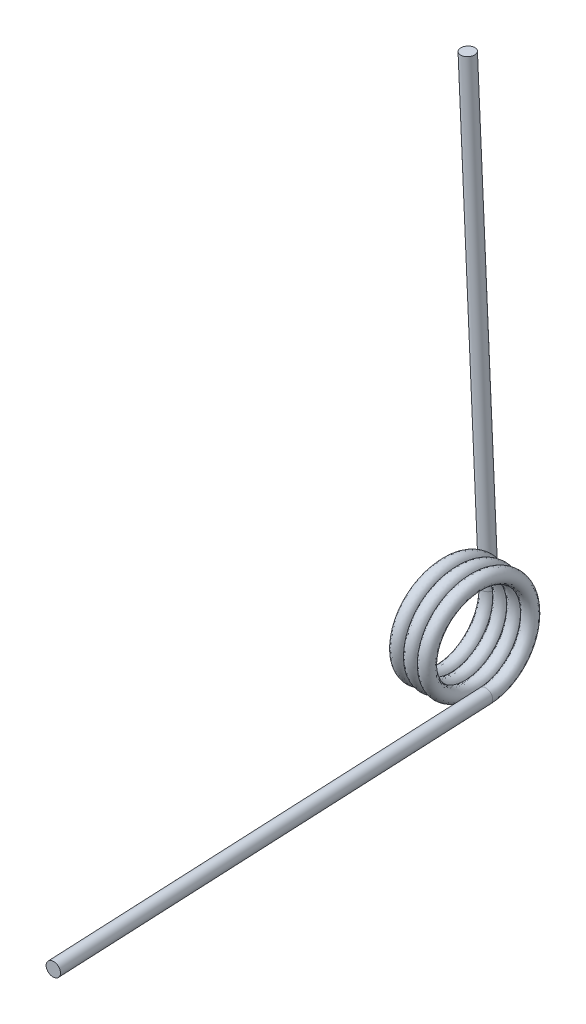
ISO-10303-21;
HEADER;
FILE_DESCRIPTION(('STEP AP214'),'2;1');
FILE_NAME('part.step','',(''),(''),'','','');
FILE_SCHEMA(('AUTOMOTIVE_DESIGN { 1 0 10303 214 1 1 1 1 }'));
ENDSEC;
DATA;
#1=APPLICATION_CONTEXT('core data for automotive mechanical design processes');
#2=APPLICATION_PROTOCOL_DEFINITION('international standard','automotive_design',2000,#1);
#3=PRODUCT_CONTEXT('',#1,'mechanical');
#4=PRODUCT('Part','Part','',(#3));
#5=PRODUCT_RELATED_PRODUCT_CATEGORY('part','',(#4));
#6=PRODUCT_DEFINITION_FORMATION('','',#4);
#7=PRODUCT_DEFINITION_CONTEXT('part definition',#1,'design');
#8=PRODUCT_DEFINITION('design','',#6,#7);
#9=PRODUCT_DEFINITION_SHAPE('','',#8);
#10=(LENGTH_UNIT() NAMED_UNIT(*) SI_UNIT(.MILLI.,.METRE.));
#11=(NAMED_UNIT(*) PLANE_ANGLE_UNIT() SI_UNIT($,.RADIAN.));
#12=(NAMED_UNIT(*) SI_UNIT($,.STERADIAN.) SOLID_ANGLE_UNIT());
#13=UNCERTAINTY_MEASURE_WITH_UNIT(LENGTH_MEASURE(1.E-05),#10,'distance_accuracy_value','');
#14=(GEOMETRIC_REPRESENTATION_CONTEXT(3) GLOBAL_UNCERTAINTY_ASSIGNED_CONTEXT((#13)) GLOBAL_UNIT_ASSIGNED_CONTEXT((#10,
#11,#12)) REPRESENTATION_CONTEXT('',''));
#15=CARTESIAN_POINT('',(0.,0.,0.));
#16=DIRECTION('',(0.,0.,1.));
#17=DIRECTION('',(1.,0.,0.));
#18=AXIS2_PLACEMENT_3D('',#15,#16,#17);
#19=CARTESIAN_POINT('',(-1.34478403028349,-9.4234,0.0617280478752123));
#20=CARTESIAN_POINT('',(-1.57126736361682,-9.4590387050573,-5.37887447880631));
#21=CARTESIAN_POINT('',(-1.79775069695015,-4.76515805758596,-8.13003976608467));
#22=CARTESIAN_POINT('',(-2.02423403028349,-0.0712774101146085,-10.881205053363));
#23=CARTESIAN_POINT('',(-2.25071736361682,4.65824194241404,-8.19176781395989));
#24=CARTESIAN_POINT('',(-2.47720069695015,9.3877612949427,-5.50233057455674));
#25=CARTESIAN_POINT('',(-2.70368403028349,9.4234,-0.0617280478752135));
#26=CARTESIAN_POINT('',(-2.93016736361682,9.45903870505731,5.37887447880631));
#27=CARTESIAN_POINT('',(-3.15665069695015,4.76515805758596,8.13003976608467));
#28=CARTESIAN_POINT('',(-3.38313403028348,0.0712774101146098,10.881205053363));
#29=CARTESIAN_POINT('',(-3.60961736361682,-4.65824194241404,8.19176781395989));
#30=CARTESIAN_POINT('',(-3.83610069695015,-9.38776129494269,5.50233057455674));
#31=CARTESIAN_POINT('',(-4.06258403028348,-9.4234,0.0617280478752123));
#32=CARTESIAN_POINT('',(-4.28906736361682,-9.4590387050573,-5.37887447880631));
#33=CARTESIAN_POINT('',(-4.51555069695015,-4.76515805758596,-8.13003976608467));
#34=CARTESIAN_POINT('',(-4.74203403028348,-0.0712774101146085,-10.881205053363));
#35=CARTESIAN_POINT('',(-4.96851736361681,4.65824194241404,-8.19176781395989));
#36=CARTESIAN_POINT('',(-5.19500069695015,9.3877612949427,-5.50233057455674));
#37=CARTESIAN_POINT('',(-5.42148403028348,9.4234,-0.0617280478752135));
#38=CARTESIAN_POINT('',(-5.64796736361681,9.45903870505731,5.37887447880631));
#39=CARTESIAN_POINT('',(-5.87445069695015,4.76515805758596,8.13003976608467));
#40=CARTESIAN_POINT('',(-6.10093403028348,0.0712774101146098,10.881205053363));
#41=CARTESIAN_POINT('',(-6.32741736361681,-4.65824194241404,8.19176781395989));
#42=CARTESIAN_POINT('',(-6.55390069695014,-9.38776129494269,5.50233057455674));
#43=CARTESIAN_POINT('',(-6.78038403028348,-9.4234,0.0617280478752123));
#44=CARTESIAN_POINT('',(-7.00686736361681,-9.4590387050573,-5.37887447880631));
#45=CARTESIAN_POINT('',(-7.23335069695014,-4.76515805758596,-8.13003976608467));
#46=CARTESIAN_POINT('',(-7.45983403028348,-0.0712774101146085,-10.881205053363));
#47=CARTESIAN_POINT('',(-7.68631736361681,4.65824194241404,-8.19176781395989));
#48=CARTESIAN_POINT('',(-7.91280069695014,9.3877612949427,-5.50233057455674));
#49=CARTESIAN_POINT('',(-8.13928403028347,9.4234,-0.0617280478752135));
#50=CARTESIAN_POINT('',(-8.36576736361681,9.45903870505731,5.37887447880631));
#51=CARTESIAN_POINT('',(-8.59225069695014,4.76515805758596,8.13003976608467));
#52=CARTESIAN_POINT('',(-8.81873403028347,0.0712774101146098,10.881205053363));
#53=CARTESIAN_POINT('',(-9.04521736361681,-4.65824194241404,8.19176781395989));
#54=CARTESIAN_POINT('',(-9.27170069695014,-9.38776129494269,5.50233057455674));
#55=CARTESIAN_POINT('',(-9.49818403028347,-9.4234,0.0617280478752123));
#56=CARTESIAN_POINT('',(-9.7246673636168,-9.4590387050573,-5.37887447880631));
#57=CARTESIAN_POINT('',(-9.95115069695014,-4.76515805758596,-8.13003976608467));
#58=CARTESIAN_POINT('',(-10.1776340302835,-0.0712774101146085,-10.881205053363));
#59=CARTESIAN_POINT('',(-10.4041173636168,4.65824194241404,-8.19176781395989));
#60=CARTESIAN_POINT('',(-10.6306006969501,9.3877612949427,-5.50233057455674));
#61=CARTESIAN_POINT('',(-10.8570840302835,9.4234,-0.0617280478752135));
#62=CARTESIAN_POINT('',(-11.0835673636168,9.45903870505731,5.37887447880631));
#63=CARTESIAN_POINT('',(-11.3100506969501,4.76515805758596,8.13003976608467));
#64=CARTESIAN_POINT('',(-11.5365340302835,0.0712774101146098,10.881205053363));
#65=CARTESIAN_POINT('',(-11.7630173636168,-4.65824194241404,8.19176781395989));
#66=CARTESIAN_POINT('',(-11.9895006969501,-9.38776129494269,5.50233057455674));
#67=CARTESIAN_POINT('',(-12.2159840302835,-9.4234,0.0617280478752123));
#68=CARTESIAN_POINT('',(-1.34478403028349,-6.731,0.0617280478752421));
#69=CARTESIAN_POINT('',(-1.57126736361682,-6.76663870505732,-3.82441661404013));
#70=CARTESIAN_POINT('',(-1.79775069695015,-3.41895805758598,-5.79835296893544));
#71=CARTESIAN_POINT('',(-2.02423403028349,-0.0712774101146428,-7.77228932383074));
#72=CARTESIAN_POINT('',(-2.25071736361682,3.31204194241402,-5.86008101681068));
#73=CARTESIAN_POINT('',(-2.47720069695015,6.69536129494268,-3.94787270979062));
#74=CARTESIAN_POINT('',(-2.70368403028348,6.731,-0.061728047875243));
#75=CARTESIAN_POINT('',(-2.93016736361682,6.76663870505732,3.82441661404013));
#76=CARTESIAN_POINT('',(-3.15665069695015,3.41895805758599,5.79835296893544));
#77=CARTESIAN_POINT('',(-3.38313403028348,0.0712774101146437,7.77228932383074));
#78=CARTESIAN_POINT('',(-3.60961736361682,-3.31204194241401,5.86008101681068));
#79=CARTESIAN_POINT('',(-3.83610069695015,-6.69536129494268,3.94787270979062));
#80=CARTESIAN_POINT('',(-4.06258403028348,-6.731,0.0617280478752421));
#81=CARTESIAN_POINT('',(-4.28906736361681,-6.76663870505732,-3.82441661404013));
#82=CARTESIAN_POINT('',(-4.51555069695015,-3.41895805758598,-5.79835296893544));
#83=CARTESIAN_POINT('',(-4.74203403028348,-0.0712774101146428,-7.77228932383074));
#84=CARTESIAN_POINT('',(-4.96851736361681,3.31204194241402,-5.86008101681068));
#85=CARTESIAN_POINT('',(-5.19500069695014,6.69536129494268,-3.94787270979062));
#86=CARTESIAN_POINT('',(-5.42148403028348,6.731,-0.061728047875243));
#87=CARTESIAN_POINT('',(-5.64796736361681,6.76663870505732,3.82441661404013));
#88=CARTESIAN_POINT('',(-5.87445069695014,3.41895805758599,5.79835296893544));
#89=CARTESIAN_POINT('',(-6.10093403028348,0.0712774101146437,7.77228932383074));
#90=CARTESIAN_POINT('',(-6.32741736361681,-3.31204194241401,5.86008101681068));
#91=CARTESIAN_POINT('',(-6.55390069695014,-6.69536129494268,3.94787270979062));
#92=CARTESIAN_POINT('',(-6.78038403028348,-6.731,0.0617280478752421));
#93=CARTESIAN_POINT('',(-7.00686736361681,-6.76663870505732,-3.82441661404013));
#94=CARTESIAN_POINT('',(-7.23335069695014,-3.41895805758598,-5.79835296893544));
#95=CARTESIAN_POINT('',(-7.45983403028347,-0.0712774101146428,-7.77228932383074));
#96=CARTESIAN_POINT('',(-7.68631736361681,3.31204194241402,-5.86008101681068));
#97=CARTESIAN_POINT('',(-7.91280069695014,6.69536129494268,-3.94787270979062));
#98=CARTESIAN_POINT('',(-8.13928403028347,6.731,-0.061728047875243));
#99=CARTESIAN_POINT('',(-8.3657673636168,6.76663870505732,3.82441661404013));
#100=CARTESIAN_POINT('',(-8.59225069695014,3.41895805758599,5.79835296893544));
#101=CARTESIAN_POINT('',(-8.81873403028347,0.0712774101146437,7.77228932383074));
#102=CARTESIAN_POINT('',(-9.0452173636168,-3.31204194241401,5.86008101681068));
#103=CARTESIAN_POINT('',(-9.27170069695014,-6.69536129494268,3.94787270979062));
#104=CARTESIAN_POINT('',(-9.49818403028347,-6.731,0.0617280478752421));
#105=CARTESIAN_POINT('',(-9.7246673636168,-6.76663870505732,-3.82441661404013));
#106=CARTESIAN_POINT('',(-9.95115069695013,-3.41895805758598,-5.79835296893544));
#107=CARTESIAN_POINT('',(-10.1776340302835,-0.0712774101146428,-7.77228932383074));
#108=CARTESIAN_POINT('',(-10.4041173636168,3.31204194241402,-5.86008101681068));
#109=CARTESIAN_POINT('',(-10.6306006969501,6.69536129494268,-3.94787270979062));
#110=CARTESIAN_POINT('',(-10.8570840302835,6.731,-0.061728047875243));
#111=CARTESIAN_POINT('',(-11.0835673636168,6.76663870505732,3.82441661404013));
#112=CARTESIAN_POINT('',(-11.3100506969501,3.41895805758599,5.79835296893544));
#113=CARTESIAN_POINT('',(-11.5365340302835,0.0712774101146437,7.77228932383074));
#114=CARTESIAN_POINT('',(-11.7630173636168,-3.31204194241401,5.86008101681068));
#115=CARTESIAN_POINT('',(-11.9895006969501,-6.69536129494268,3.94787270979062));
#116=CARTESIAN_POINT('',(-12.2159840302835,-6.731,0.0617280478752421));
#117=CARTESIAN_POINT('',(1.34478403028349,-6.731,-0.0617280478753799));
#118=CARTESIAN_POINT('',(1.11830069695016,-6.6953612949426,-3.94787270979075));
#119=CARTESIAN_POINT('',(0.891817363616824,-3.3120419424139,-5.86008101681075));
#120=CARTESIAN_POINT('',(0.665334030283492,0.0712774101148008,-7.77228932383074));
#121=CARTESIAN_POINT('',(0.438850696950159,3.4189580575861,-5.79835296893537));
#122=CARTESIAN_POINT('',(0.212367363616826,6.7666387050574,-3.82441661403999));
#123=CARTESIAN_POINT('',(-0.0141159697165068,6.731,0.061728047875379));
#124=CARTESIAN_POINT('',(-0.24059930304984,6.6953612949426,3.94787270979075));
#125=CARTESIAN_POINT('',(-0.467082636383172,3.3120419424139,5.86008101681075));
#126=CARTESIAN_POINT('',(-0.693565969716505,-0.0712774101147999,7.77228932383074));
#127=CARTESIAN_POINT('',(-0.920049303049838,-3.4189580575861,5.79835296893537));
#128=CARTESIAN_POINT('',(-1.14653263638317,-6.7666387050574,3.82441661404));
#129=CARTESIAN_POINT('',(-1.3730159697165,-6.731,-0.0617280478753799));
#130=CARTESIAN_POINT('',(-1.59949930304984,-6.6953612949426,-3.94787270979075));
#131=CARTESIAN_POINT('',(-1.82598263638317,-3.3120419424139,-5.86008101681075));
#132=CARTESIAN_POINT('',(-2.0524659697165,0.0712774101148008,-7.77228932383074));
#133=CARTESIAN_POINT('',(-2.27894930304983,3.4189580575861,-5.79835296893537));
#134=CARTESIAN_POINT('',(-2.50543263638317,6.7666387050574,-3.82441661403999));
#135=CARTESIAN_POINT('',(-2.7319159697165,6.731,0.061728047875379));
#136=CARTESIAN_POINT('',(-2.95839930304983,6.6953612949426,3.94787270979075));
#137=CARTESIAN_POINT('',(-3.18488263638317,3.3120419424139,5.86008101681075));
#138=CARTESIAN_POINT('',(-3.4113659697165,-0.0712774101147999,7.77228932383074));
#139=CARTESIAN_POINT('',(-3.63784930304983,-3.4189580575861,5.79835296893537));
#140=CARTESIAN_POINT('',(-3.86433263638317,-6.7666387050574,3.82441661404));
#141=CARTESIAN_POINT('',(-4.0908159697165,-6.731,-0.0617280478753799));
#142=CARTESIAN_POINT('',(-4.31729930304983,-6.6953612949426,-3.94787270979075));
#143=CARTESIAN_POINT('',(-4.54378263638316,-3.3120419424139,-5.86008101681075));
#144=CARTESIAN_POINT('',(-4.7702659697165,0.0712774101148008,-7.77228932383074));
#145=CARTESIAN_POINT('',(-4.99674930304983,3.4189580575861,-5.79835296893537));
#146=CARTESIAN_POINT('',(-5.22323263638316,6.7666387050574,-3.82441661403999));
#147=CARTESIAN_POINT('',(-5.44971596971649,6.731,0.061728047875379));
#148=CARTESIAN_POINT('',(-5.67619930304983,6.6953612949426,3.94787270979075));
#149=CARTESIAN_POINT('',(-5.90268263638316,3.3120419424139,5.86008101681075));
#150=CARTESIAN_POINT('',(-6.12916596971649,-0.0712774101147999,7.77228932383074));
#151=CARTESIAN_POINT('',(-6.35564930304983,-3.4189580575861,5.79835296893537));
#152=CARTESIAN_POINT('',(-6.58213263638316,-6.7666387050574,3.82441661404));
#153=CARTESIAN_POINT('',(-6.80861596971649,-6.731,-0.0617280478753799));
#154=CARTESIAN_POINT('',(-7.03509930304982,-6.6953612949426,-3.94787270979075));
#155=CARTESIAN_POINT('',(-7.26158263638316,-3.3120419424139,-5.86008101681075));
#156=CARTESIAN_POINT('',(-7.48806596971649,0.0712774101148008,-7.77228932383074));
#157=CARTESIAN_POINT('',(-7.71454930304982,3.4189580575861,-5.79835296893537));
#158=CARTESIAN_POINT('',(-7.94103263638315,6.7666387050574,-3.82441661403999));
#159=CARTESIAN_POINT('',(-8.16751596971649,6.731,0.061728047875379));
#160=CARTESIAN_POINT('',(-8.39399930304982,6.6953612949426,3.94787270979075));
#161=CARTESIAN_POINT('',(-8.62048263638315,3.3120419424139,5.86008101681075));
#162=CARTESIAN_POINT('',(-8.84696596971649,-0.0712774101147999,7.77228932383074));
#163=CARTESIAN_POINT('',(-9.07344930304982,-3.4189580575861,5.79835296893537));
#164=CARTESIAN_POINT('',(-9.29993263638315,-6.7666387050574,3.82441661404));
#165=CARTESIAN_POINT('',(-9.52641596971648,-6.731,-0.0617280478753799));
#166=CARTESIAN_POINT('',(1.34478403028349,-9.4234,-0.0617280478754097));
#167=CARTESIAN_POINT('',(1.11830069695016,-9.38776129494258,-5.50233057455693));
#168=CARTESIAN_POINT('',(0.891817363616823,-4.65824194241388,-8.19176781395999));
#169=CARTESIAN_POINT('',(0.66533403028349,0.0712774101148351,-10.881205053363));
#170=CARTESIAN_POINT('',(0.438850696950158,4.76515805758613,-8.13003976608458));
#171=CARTESIAN_POINT('',(0.212367363616825,9.45903870505742,-5.37887447880611));
#172=CARTESIAN_POINT('',(-0.0141159697165079,9.4234,0.0617280478754086));
#173=CARTESIAN_POINT('',(-0.240599303049841,9.38776129494259,5.50233057455693));
#174=CARTESIAN_POINT('',(-0.467082636383174,4.65824194241388,8.19176781395998));
#175=CARTESIAN_POINT('',(-0.693565969716506,-0.0712774101148338,10.881205053363));
#176=CARTESIAN_POINT('',(-0.920049303049839,-4.76515805758612,8.13003976608458));
#177=CARTESIAN_POINT('',(-1.14653263638317,-9.45903870505742,5.37887447880612));
#178=CARTESIAN_POINT('',(-1.3730159697165,-9.4234,-0.0617280478754097));
#179=CARTESIAN_POINT('',(-1.59949930304984,-9.38776129494258,-5.50233057455693));
#180=CARTESIAN_POINT('',(-1.82598263638317,-4.65824194241388,-8.19176781395999));
#181=CARTESIAN_POINT('',(-2.0524659697165,0.0712774101148351,-10.881205053363));
#182=CARTESIAN_POINT('',(-2.27894930304984,4.76515805758613,-8.13003976608458));
#183=CARTESIAN_POINT('',(-2.50543263638317,9.45903870505742,-5.37887447880611));
#184=CARTESIAN_POINT('',(-2.7319159697165,9.4234,0.0617280478754086));
#185=CARTESIAN_POINT('',(-2.95839930304983,9.38776129494259,5.50233057455693));
#186=CARTESIAN_POINT('',(-3.18488263638317,4.65824194241388,8.19176781395998));
#187=CARTESIAN_POINT('',(-3.4113659697165,-0.0712774101148338,10.881205053363));
#188=CARTESIAN_POINT('',(-3.63784930304983,-4.76515805758612,8.13003976608458));
#189=CARTESIAN_POINT('',(-3.86433263638317,-9.45903870505742,5.37887447880612));
#190=CARTESIAN_POINT('',(-4.0908159697165,-9.4234,-0.0617280478754097));
#191=CARTESIAN_POINT('',(-4.31729930304983,-9.38776129494258,-5.50233057455693));
#192=CARTESIAN_POINT('',(-4.54378263638316,-4.65824194241388,-8.19176781395999));
#193=CARTESIAN_POINT('',(-4.7702659697165,0.0712774101148351,-10.881205053363));
#194=CARTESIAN_POINT('',(-4.99674930304983,4.76515805758613,-8.13003976608458));
#195=CARTESIAN_POINT('',(-5.22323263638316,9.45903870505742,-5.37887447880611));
#196=CARTESIAN_POINT('',(-5.44971596971649,9.4234,0.0617280478754086));
#197=CARTESIAN_POINT('',(-5.67619930304983,9.38776129494259,5.50233057455693));
#198=CARTESIAN_POINT('',(-5.90268263638316,4.65824194241388,8.19176781395998));
#199=CARTESIAN_POINT('',(-6.12916596971649,-0.0712774101148338,10.881205053363));
#200=CARTESIAN_POINT('',(-6.35564930304983,-4.76515805758612,8.13003976608458));
#201=CARTESIAN_POINT('',(-6.58213263638316,-9.45903870505742,5.37887447880612));
#202=CARTESIAN_POINT('',(-6.80861596971649,-9.4234,-0.0617280478754097));
#203=CARTESIAN_POINT('',(-7.03509930304982,-9.38776129494258,-5.50233057455693));
#204=CARTESIAN_POINT('',(-7.26158263638316,-4.65824194241388,-8.19176781395999));
#205=CARTESIAN_POINT('',(-7.48806596971649,0.0712774101148351,-10.881205053363));
#206=CARTESIAN_POINT('',(-7.71454930304982,4.76515805758613,-8.13003976608458));
#207=CARTESIAN_POINT('',(-7.94103263638316,9.45903870505742,-5.37887447880611));
#208=CARTESIAN_POINT('',(-8.16751596971649,9.4234,0.0617280478754086));
#209=CARTESIAN_POINT('',(-8.39399930304982,9.38776129494259,5.50233057455693));
#210=CARTESIAN_POINT('',(-8.62048263638316,4.65824194241388,8.19176781395998));
#211=CARTESIAN_POINT('',(-8.84696596971649,-0.0712774101148338,10.881205053363));
#212=CARTESIAN_POINT('',(-9.07344930304982,-4.76515805758612,8.13003976608458));
#213=CARTESIAN_POINT('',(-9.29993263638315,-9.45903870505742,5.37887447880612));
#214=CARTESIAN_POINT('',(-9.52641596971648,-9.4234,-0.0617280478754097));
#215=CARTESIAN_POINT('',(1.34478403028349,-12.1158,-0.0617280478754396));
#216=CARTESIAN_POINT('',(1.11830069695016,-12.0801612949426,-7.05678843932311));
#217=CARTESIAN_POINT('',(0.891817363616822,-6.00444194241385,-10.5234546111092));
#218=CARTESIAN_POINT('',(0.66533403028349,0.0712774101148694,-13.9901207828953));
#219=CARTESIAN_POINT('',(0.438850696950157,6.11135805758615,-10.4617265632338));
#220=CARTESIAN_POINT('',(0.212367363616824,12.1514387050574,-6.93333234357223));
#221=CARTESIAN_POINT('',(-0.014115969716509,12.1158,0.0617280478754381));
#222=CARTESIAN_POINT('',(-0.240599303049842,12.0801612949426,7.0567884393231));
#223=CARTESIAN_POINT('',(-0.467082636383175,6.00444194241385,10.5234546111092));
#224=CARTESIAN_POINT('',(-0.693565969716507,-0.0712774101148677,13.9901207828953));
#225=CARTESIAN_POINT('',(-0.92004930304984,-6.11135805758615,10.4617265632338));
#226=CARTESIAN_POINT('',(-1.14653263638317,-12.1514387050574,6.93333234357224));
#227=CARTESIAN_POINT('',(-1.37301596971651,-12.1158,-0.0617280478754396));
#228=CARTESIAN_POINT('',(-1.59949930304984,-12.0801612949426,-7.05678843932311));
#229=CARTESIAN_POINT('',(-1.82598263638317,-6.00444194241385,-10.5234546111092));
#230=CARTESIAN_POINT('',(-2.0524659697165,0.0712774101148694,-13.9901207828953));
#231=CARTESIAN_POINT('',(-2.27894930304984,6.11135805758615,-10.4617265632338));
#232=CARTESIAN_POINT('',(-2.50543263638317,12.1514387050574,-6.93333234357223));
#233=CARTESIAN_POINT('',(-2.7319159697165,12.1158,0.0617280478754381));
#234=CARTESIAN_POINT('',(-2.95839930304984,12.0801612949426,7.0567884393231));
#235=CARTESIAN_POINT('',(-3.18488263638317,6.00444194241385,10.5234546111092));
#236=CARTESIAN_POINT('',(-3.4113659697165,-0.0712774101148677,13.9901207828953));
#237=CARTESIAN_POINT('',(-3.63784930304983,-6.11135805758615,10.4617265632338));
#238=CARTESIAN_POINT('',(-3.86433263638317,-12.1514387050574,6.93333234357224));
#239=CARTESIAN_POINT('',(-4.0908159697165,-12.1158,-0.0617280478754396));
#240=CARTESIAN_POINT('',(-4.31729930304983,-12.0801612949426,-7.05678843932311));
#241=CARTESIAN_POINT('',(-4.54378263638317,-6.00444194241385,-10.5234546111092));
#242=CARTESIAN_POINT('',(-4.7702659697165,0.0712774101148694,-13.9901207828953));
#243=CARTESIAN_POINT('',(-4.99674930304983,6.11135805758615,-10.4617265632338));
#244=CARTESIAN_POINT('',(-5.22323263638316,12.1514387050574,-6.93333234357223));
#245=CARTESIAN_POINT('',(-5.4497159697165,12.1158,0.0617280478754381));
#246=CARTESIAN_POINT('',(-5.67619930304983,12.0801612949426,7.0567884393231));
#247=CARTESIAN_POINT('',(-5.90268263638316,6.00444194241385,10.5234546111092));
#248=CARTESIAN_POINT('',(-6.1291659697165,-0.0712774101148677,13.9901207828953));
#249=CARTESIAN_POINT('',(-6.35564930304983,-6.11135805758615,10.4617265632338));
#250=CARTESIAN_POINT('',(-6.58213263638316,-12.1514387050574,6.93333234357224));
#251=CARTESIAN_POINT('',(-6.80861596971649,-12.1158,-0.0617280478754396));
#252=CARTESIAN_POINT('',(-7.03509930304983,-12.0801612949426,-7.05678843932311));
#253=CARTESIAN_POINT('',(-7.26158263638316,-6.00444194241385,-10.5234546111092));
#254=CARTESIAN_POINT('',(-7.48806596971649,0.0712774101148694,-13.9901207828953));
#255=CARTESIAN_POINT('',(-7.71454930304982,6.11135805758615,-10.4617265632338));
#256=CARTESIAN_POINT('',(-7.94103263638316,12.1514387050574,-6.93333234357223));
#257=CARTESIAN_POINT('',(-8.16751596971649,12.1158,0.0617280478754381));
#258=CARTESIAN_POINT('',(-8.39399930304982,12.0801612949426,7.0567884393231));
#259=CARTESIAN_POINT('',(-8.62048263638316,6.00444194241385,10.5234546111092));
#260=CARTESIAN_POINT('',(-8.84696596971649,-0.0712774101148677,13.9901207828953));
#261=CARTESIAN_POINT('',(-9.07344930304982,-6.11135805758615,10.4617265632338));
#262=CARTESIAN_POINT('',(-9.29993263638315,-12.1514387050574,6.93333234357224));
#263=CARTESIAN_POINT('',(-9.52641596971649,-12.1158,-0.0617280478754396));
#264=CARTESIAN_POINT('',(-1.34478403028349,-12.1158,0.0617280478751825));
#265=CARTESIAN_POINT('',(-1.57126736361682,-12.1514387050573,-6.93333234357249));
#266=CARTESIAN_POINT('',(-1.79775069695016,-6.11135805758593,-10.4617265632339));
#267=CARTESIAN_POINT('',(-2.02423403028349,-0.0712774101145743,-13.9901207828953));
#268=CARTESIAN_POINT('',(-2.25071736361682,6.00444194241407,-10.5234546111091));
#269=CARTESIAN_POINT('',(-2.47720069695015,12.0801612949427,-7.05678843932286));
#270=CARTESIAN_POINT('',(-2.70368403028349,12.1158,-0.0617280478751839));
#271=CARTESIAN_POINT('',(-2.93016736361682,12.1514387050573,6.93333234357248));
#272=CARTESIAN_POINT('',(-3.15665069695015,6.11135805758594,10.4617265632339));
#273=CARTESIAN_POINT('',(-3.38313403028349,0.071277410114576,13.9901207828953));
#274=CARTESIAN_POINT('',(-3.60961736361682,-6.00444194241406,10.5234546111091));
#275=CARTESIAN_POINT('',(-3.83610069695015,-12.0801612949427,7.05678843932286));
#276=CARTESIAN_POINT('',(-4.06258403028348,-12.1158,0.0617280478751825));
#277=CARTESIAN_POINT('',(-4.28906736361682,-12.1514387050573,-6.93333234357249));
#278=CARTESIAN_POINT('',(-4.51555069695015,-6.11135805758593,-10.4617265632339));
#279=CARTESIAN_POINT('',(-4.74203403028348,-0.0712774101145743,-13.9901207828953));
#280=CARTESIAN_POINT('',(-4.96851736361682,6.00444194241407,-10.5234546111091));
#281=CARTESIAN_POINT('',(-5.19500069695015,12.0801612949427,-7.05678843932286));
#282=CARTESIAN_POINT('',(-5.42148403028348,12.1158,-0.0617280478751839));
#283=CARTESIAN_POINT('',(-5.64796736361681,12.1514387050573,6.93333234357248));
#284=CARTESIAN_POINT('',(-5.87445069695015,6.11135805758594,10.4617265632339));
#285=CARTESIAN_POINT('',(-6.10093403028348,0.071277410114576,13.9901207828953));
#286=CARTESIAN_POINT('',(-6.32741736361681,-6.00444194241406,10.5234546111091));
#287=CARTESIAN_POINT('',(-6.55390069695015,-12.0801612949427,7.05678843932286));
#288=CARTESIAN_POINT('',(-6.78038403028348,-12.1158,0.0617280478751825));
#289=CARTESIAN_POINT('',(-7.00686736361681,-12.1514387050573,-6.93333234357249));
#290=CARTESIAN_POINT('',(-7.23335069695014,-6.11135805758593,-10.4617265632339));
#291=CARTESIAN_POINT('',(-7.45983403028348,-0.0712774101145743,-13.9901207828953));
#292=CARTESIAN_POINT('',(-7.68631736361681,6.00444194241407,-10.5234546111091));
#293=CARTESIAN_POINT('',(-7.91280069695014,12.0801612949427,-7.05678843932286));
#294=CARTESIAN_POINT('',(-8.13928403028348,12.1158,-0.0617280478751839));
#295=CARTESIAN_POINT('',(-8.36576736361681,12.1514387050573,6.93333234357248));
#296=CARTESIAN_POINT('',(-8.59225069695014,6.11135805758594,10.4617265632339));
#297=CARTESIAN_POINT('',(-8.81873403028347,0.071277410114576,13.9901207828953));
#298=CARTESIAN_POINT('',(-9.04521736361681,-6.00444194241406,10.5234546111091));
#299=CARTESIAN_POINT('',(-9.27170069695014,-12.0801612949427,7.05678843932286));
#300=CARTESIAN_POINT('',(-9.49818403028347,-12.1158,0.0617280478751825));
#301=CARTESIAN_POINT('',(-9.7246673636168,-12.1514387050573,-6.93333234357249));
#302=CARTESIAN_POINT('',(-9.95115069695014,-6.11135805758593,-10.4617265632339));
#303=CARTESIAN_POINT('',(-10.1776340302835,-0.0712774101145743,-13.9901207828953));
#304=CARTESIAN_POINT('',(-10.4041173636168,6.00444194241407,-10.5234546111091));
#305=CARTESIAN_POINT('',(-10.6306006969501,12.0801612949427,-7.05678843932286));
#306=CARTESIAN_POINT('',(-10.8570840302835,12.1158,-0.0617280478751839));
#307=CARTESIAN_POINT('',(-11.0835673636168,12.1514387050573,6.93333234357248));
#308=CARTESIAN_POINT('',(-11.3100506969501,6.11135805758594,10.4617265632339));
#309=CARTESIAN_POINT('',(-11.5365340302835,0.071277410114576,13.9901207828953));
#310=CARTESIAN_POINT('',(-11.7630173636168,-6.00444194241406,10.5234546111091));
#311=CARTESIAN_POINT('',(-11.9895006969501,-12.0801612949427,7.05678843932286));
#312=CARTESIAN_POINT('',(-12.2159840302835,-12.1158,0.0617280478751825));
#313=CARTESIAN_POINT('',(-1.34478403028349,-9.4234,0.0617280478752123));
#314=CARTESIAN_POINT('',(-1.57126736361682,-9.4590387050573,-5.37887447880631));
#315=CARTESIAN_POINT('',(-1.79775069695015,-4.76515805758596,-8.13003976608467));
#316=CARTESIAN_POINT('',(-2.02423403028349,-0.0712774101146085,-10.881205053363));
#317=CARTESIAN_POINT('',(-2.25071736361682,4.65824194241404,-8.19176781395989));
#318=CARTESIAN_POINT('',(-2.47720069695015,9.3877612949427,-5.50233057455674));
#319=CARTESIAN_POINT('',(-2.70368403028349,9.4234,-0.0617280478752135));
#320=CARTESIAN_POINT('',(-2.93016736361682,9.45903870505731,5.37887447880631));
#321=CARTESIAN_POINT('',(-3.15665069695015,4.76515805758596,8.13003976608467));
#322=CARTESIAN_POINT('',(-3.38313403028348,0.0712774101146098,10.881205053363));
#323=CARTESIAN_POINT('',(-3.60961736361682,-4.65824194241404,8.19176781395989));
#324=CARTESIAN_POINT('',(-3.83610069695015,-9.38776129494269,5.50233057455674));
#325=CARTESIAN_POINT('',(-4.06258403028348,-9.4234,0.0617280478752123));
#326=CARTESIAN_POINT('',(-4.28906736361682,-9.4590387050573,-5.37887447880631));
#327=CARTESIAN_POINT('',(-4.51555069695015,-4.76515805758596,-8.13003976608467));
#328=CARTESIAN_POINT('',(-4.74203403028348,-0.0712774101146085,-10.881205053363));
#329=CARTESIAN_POINT('',(-4.96851736361681,4.65824194241404,-8.19176781395989));
#330=CARTESIAN_POINT('',(-5.19500069695015,9.3877612949427,-5.50233057455674));
#331=CARTESIAN_POINT('',(-5.42148403028348,9.4234,-0.0617280478752135));
#332=CARTESIAN_POINT('',(-5.64796736361681,9.45903870505731,5.37887447880631));
#333=CARTESIAN_POINT('',(-5.87445069695015,4.76515805758596,8.13003976608467));
#334=CARTESIAN_POINT('',(-6.10093403028348,0.0712774101146098,10.881205053363));
#335=CARTESIAN_POINT('',(-6.32741736361681,-4.65824194241404,8.19176781395989));
#336=CARTESIAN_POINT('',(-6.55390069695014,-9.38776129494269,5.50233057455674));
#337=CARTESIAN_POINT('',(-6.78038403028348,-9.4234,0.0617280478752123));
#338=CARTESIAN_POINT('',(-7.00686736361681,-9.4590387050573,-5.37887447880631));
#339=CARTESIAN_POINT('',(-7.23335069695014,-4.76515805758596,-8.13003976608467));
#340=CARTESIAN_POINT('',(-7.45983403028348,-0.0712774101146085,-10.881205053363));
#341=CARTESIAN_POINT('',(-7.68631736361681,4.65824194241404,-8.19176781395989));
#342=CARTESIAN_POINT('',(-7.91280069695014,9.3877612949427,-5.50233057455674));
#343=CARTESIAN_POINT('',(-8.13928403028347,9.4234,-0.0617280478752135));
#344=CARTESIAN_POINT('',(-8.36576736361681,9.45903870505731,5.37887447880631));
#345=CARTESIAN_POINT('',(-8.59225069695014,4.76515805758596,8.13003976608467));
#346=CARTESIAN_POINT('',(-8.81873403028347,0.0712774101146098,10.881205053363));
#347=CARTESIAN_POINT('',(-9.04521736361681,-4.65824194241404,8.19176781395989));
#348=CARTESIAN_POINT('',(-9.27170069695014,-9.38776129494269,5.50233057455674));
#349=CARTESIAN_POINT('',(-9.49818403028347,-9.4234,0.0617280478752123));
#350=CARTESIAN_POINT('',(-9.7246673636168,-9.4590387050573,-5.37887447880631));
#351=CARTESIAN_POINT('',(-9.95115069695014,-4.76515805758596,-8.13003976608467));
#352=CARTESIAN_POINT('',(-10.1776340302835,-0.0712774101146085,-10.881205053363));
#353=CARTESIAN_POINT('',(-10.4041173636168,4.65824194241404,-8.19176781395989));
#354=CARTESIAN_POINT('',(-10.6306006969501,9.3877612949427,-5.50233057455674));
#355=CARTESIAN_POINT('',(-10.8570840302835,9.4234,-0.0617280478752135));
#356=CARTESIAN_POINT('',(-11.0835673636168,9.45903870505731,5.37887447880631));
#357=CARTESIAN_POINT('',(-11.3100506969501,4.76515805758596,8.13003976608467));
#358=CARTESIAN_POINT('',(-11.5365340302835,0.0712774101146098,10.881205053363));
#359=CARTESIAN_POINT('',(-11.7630173636168,-4.65824194241404,8.19176781395989));
#360=CARTESIAN_POINT('',(-11.9895006969501,-9.38776129494269,5.50233057455674));
#361=CARTESIAN_POINT('',(-12.2159840302835,-9.4234,0.0617280478752123));
#362=(BOUNDED_SURFACE() B_SPLINE_SURFACE(3,2,((#19,#20,#21,#22,#23,#24,#25,#26,#27,#28,#29,#30,
#31,#32,#33,#34,#35,#36,#37,#38,#39,#40,#41,#42,#43,#44,#45,#46,#47,#48,#49,#50,#51,#52,#53,#54,
#55,#56,#57,#58,#59,#60,#61,#62,#63,#64,#65,#66,#67),(#68,#69,#70,#71,#72,#73,#74,#75,#76,#77,
#78,#79,#80,#81,#82,#83,#84,#85,#86,#87,#88,#89,#90,#91,#92,#93,#94,#95,#96,#97,#98,#99,#100,
#101,#102,#103,#104,#105,#106,#107,#108,#109,#110,#111,#112,#113,#114,#115,#116),(#117,#118,
#119,#120,#121,#122,#123,#124,#125,#126,#127,#128,#129,#130,#131,#132,#133,#134,#135,#136,#137,
#138,#139,#140,#141,#142,#143,#144,#145,#146,#147,#148,#149,#150,#151,#152,#153,#154,#155,#156,
#157,#158,#159,#160,#161,#162,#163,#164,#165),(#166,#167,#168,#169,#170,#171,#172,#173,#174,
#175,#176,#177,#178,#179,#180,#181,#182,#183,#184,#185,#186,#187,#188,#189,#190,#191,#192,#193,
#194,#195,#196,#197,#198,#199,#200,#201,#202,#203,#204,#205,#206,#207,#208,#209,#210,#211,#212,
#213,#214),(#215,#216,#217,#218,#219,#220,#221,#222,#223,#224,#225,#226,#227,#228,#229,#230,
#231,#232,#233,#234,#235,#236,#237,#238,#239,#240,#241,#242,#243,#244,#245,#246,#247,#248,#249,
#250,#251,#252,#253,#254,#255,#256,#257,#258,#259,#260,#261,#262,#263),(#264,#265,#266,#267,
#268,#269,#270,#271,#272,#273,#274,#275,#276,#277,#278,#279,#280,#281,#282,#283,#284,#285,#286,
#287,#288,#289,#290,#291,#292,#293,#294,#295,#296,#297,#298,#299,#300,#301,#302,#303,#304,#305,
#306,#307,#308,#309,#310,#311,#312),(#313,#314,#315,#316,#317,#318,#319,#320,#321,#322,#323,
#324,#325,#326,#327,#328,#329,#330,#331,#332,#333,#334,#335,#336,#337,#338,#339,#340,#341,#342,
#343,#344,#345,#346,#347,#348,#349,#350,#351,#352,#353,#354,#355,#356,#357,#358,#359,#360,
#361)),.UNSPECIFIED.,.T.,.F.,.F.) B_SPLINE_SURFACE_WITH_KNOTS((4,3,4),(3,2,2,2,2,2,2,2,2,2,2,2,
2,2,2,2,2,2,2,2,2,2,2,2,3),(0.,0.5,1.),(0.,0.0416666666666667,0.0833333333333333,0.125,
0.166666666666667,0.208333333333333,0.25,0.291666666666667,0.333333333333333,0.375,
0.416666666666667,0.458333333333333,0.5,0.541666666666667,0.583333333333333,0.625,
0.666666666666667,0.708333333333333,0.75,0.791666666666667,0.833333333333333,0.875,
0.916666666666667,0.958333333333333,1.),
.UNSPECIFIED.) GEOMETRIC_REPRESENTATION_ITEM() RATIONAL_B_SPLINE_SURFACE(((1.,0.866025403784439,
1.,0.866025403784439,1.,0.866025403784439,1.,0.866025403784439,1.,0.866025403784439,1.,
0.866025403784439,1.,0.866025403784439,1.,0.866025403784439,1.,0.866025403784439,1.,
0.866025403784439,1.,0.866025403784439,1.,0.866025403784439,1.,0.866025403784439,1.,
0.866025403784439,1.,0.866025403784439,1.,0.866025403784439,1.,0.866025403784439,1.,
0.866025403784439,1.,0.866025403784439,1.,0.866025403784439,1.,0.866025403784439,1.,
0.866025403784439,1.,0.866025403784439,1.,0.866025403784439,1.),(0.333333333333333,
0.288675134594813,0.333333333333333,0.288675134594813,0.333333333333333,0.288675134594813,
0.333333333333333,0.288675134594813,0.333333333333333,0.288675134594813,0.333333333333333,
0.288675134594813,0.333333333333333,0.288675134594813,0.333333333333333,0.288675134594813,
0.333333333333333,0.288675134594813,0.333333333333333,0.288675134594813,0.333333333333333,
0.288675134594813,0.333333333333333,0.288675134594813,0.333333333333333,0.288675134594813,
0.333333333333333,0.288675134594813,0.333333333333333,0.288675134594813,0.333333333333333,
0.288675134594813,0.333333333333333,0.288675134594813,0.333333333333333,0.288675134594813,
0.333333333333333,0.288675134594813,0.333333333333333,0.288675134594813,0.333333333333333,
0.288675134594813,0.333333333333333,0.288675134594813,0.333333333333333,0.288675134594813,
0.333333333333333,0.288675134594813,0.333333333333333),(0.333333333333333,0.288675134594813,
0.333333333333333,0.288675134594813,0.333333333333333,0.288675134594813,0.333333333333333,
0.288675134594813,0.333333333333333,0.288675134594813,0.333333333333333,0.288675134594813,
0.333333333333333,0.288675134594813,0.333333333333333,0.288675134594813,0.333333333333333,
0.288675134594813,0.333333333333333,0.288675134594813,0.333333333333333,0.288675134594813,
0.333333333333333,0.288675134594813,0.333333333333333,0.288675134594813,0.333333333333333,
0.288675134594813,0.333333333333333,0.288675134594813,0.333333333333333,0.288675134594813,
0.333333333333333,0.288675134594813,0.333333333333333,0.288675134594813,0.333333333333333,
0.288675134594813,0.333333333333333,0.288675134594813,0.333333333333333,0.288675134594813,
0.333333333333333,0.288675134594813,0.333333333333333,0.288675134594813,0.333333333333333,
0.288675134594813,0.333333333333333),(1.,0.866025403784439,1.,0.866025403784439,1.,
0.866025403784439,1.,0.866025403784439,1.,0.866025403784439,1.,0.866025403784439,1.,
0.866025403784439,1.,0.866025403784439,1.,0.866025403784439,1.,0.866025403784439,1.,
0.866025403784439,1.,0.866025403784439,1.,0.866025403784439,1.,0.866025403784439,1.,
0.866025403784439,1.,0.866025403784439,1.,0.866025403784439,1.,0.866025403784439,1.,
0.866025403784439,1.,0.866025403784439,1.,0.866025403784439,1.,0.866025403784439,1.,
0.866025403784439,1.,0.866025403784439,1.),(0.333333333333333,0.288675134594813,
0.333333333333333,0.288675134594813,0.333333333333333,0.288675134594813,0.333333333333333,
0.288675134594813,0.333333333333333,0.288675134594813,0.333333333333333,0.288675134594813,
0.333333333333333,0.288675134594813,0.333333333333333,0.288675134594813,0.333333333333333,
0.288675134594813,0.333333333333333,0.288675134594813,0.333333333333333,0.288675134594813,
0.333333333333333,0.288675134594813,0.333333333333333,0.288675134594813,0.333333333333333,
0.288675134594813,0.333333333333333,0.288675134594813,0.333333333333333,0.288675134594813,
0.333333333333333,0.288675134594813,0.333333333333333,0.288675134594813,0.333333333333333,
0.288675134594813,0.333333333333333,0.288675134594813,0.333333333333333,0.288675134594813,
0.333333333333333,0.288675134594813,0.333333333333333,0.288675134594813,0.333333333333333,
0.288675134594813,0.333333333333333),(0.333333333333333,0.288675134594813,0.333333333333333,
0.288675134594813,0.333333333333333,0.288675134594813,0.333333333333333,0.288675134594813,
0.333333333333333,0.288675134594813,0.333333333333333,0.288675134594813,0.333333333333333,
0.288675134594813,0.333333333333333,0.288675134594813,0.333333333333333,0.288675134594813,
0.333333333333333,0.288675134594813,0.333333333333333,0.288675134594813,0.333333333333333,
0.288675134594813,0.333333333333333,0.288675134594813,0.333333333333333,0.288675134594813,
0.333333333333333,0.288675134594813,0.333333333333333,0.288675134594813,0.333333333333333,
0.288675134594813,0.333333333333333,0.288675134594813,0.333333333333333,0.288675134594813,
0.333333333333333,0.288675134594813,0.333333333333333,0.288675134594813,0.333333333333333,
0.288675134594813,0.333333333333333,0.288675134594813,0.333333333333333,0.288675134594813,
0.333333333333333),(1.,0.866025403784439,1.,0.866025403784439,1.,0.866025403784439,1.,
0.866025403784439,1.,0.866025403784439,1.,0.866025403784439,1.,0.866025403784439,1.,
0.866025403784439,1.,0.866025403784439,1.,0.866025403784439,1.,0.866025403784439,1.,
0.866025403784439,1.,0.866025403784439,1.,0.866025403784439,1.,0.866025403784439,1.,
0.866025403784439,1.,0.866025403784439,1.,0.866025403784439,1.,0.866025403784439,1.,
0.866025403784439,1.,0.866025403784439,1.,0.866025403784439,1.,0.866025403784439,1.,
0.866025403784439,1.))) REPRESENTATION_ITEM('') SURFACE());
#363=CARTESIAN_POINT('',(-8.83285,5.43161236605051E-13,-9.4234));
#364=DIRECTION('',(-0.0458535491571171,0.998948172844666,0.));
#365=DIRECTION('',(-0.998948172844666,-0.0458535491571171,0.));
#366=AXIS2_PLACEMENT_3D('',#363,#364,#365);
#367=CIRCLE('',#366,1.3462);
#368=CARTESIAN_POINT('',(-10.1776340302835,-0.0617280478747678,-9.42340000000001));
#369=VERTEX_POINT('',#368);
#370=EDGE_CURVE('E10',#369,#369,#367,.T.);
#371=CARTESIAN_POINT('',(0.,-9.4234,-1.04656002830952E-13));
#372=DIRECTION('',(0.0458535491571171,0.,0.998948172844666));
#373=DIRECTION('',(0.998948172844666,0.,-0.0458535491571171));
#374=AXIS2_PLACEMENT_3D('',#371,#372,#373);
#375=CIRCLE('',#374,1.3462);
#376=CARTESIAN_POINT('',(1.34478403028349,-9.4234,-0.0617280478754156));
#377=VERTEX_POINT('',#376);
#378=EDGE_CURVE('E53',#377,#377,#375,.T.);
#379=ORIENTED_EDGE('',*,*,#370,.F.);
#380=EDGE_LOOP('',(#379));
#381=FACE_BOUND('',#380,.T.);
#382=ORIENTED_EDGE('',*,*,#378,.F.);
#383=EDGE_LOOP('',(#382));
#384=FACE_BOUND('',#383,.T.);
#385=ADVANCED_FACE('F39',(#381,#384),#362,.T.);
#386=CARTESIAN_POINT('',(4.07638052006771,-9.42340000000099,88.8064925658907));
#387=DIRECTION('',(-0.0458535491571171,0.,-0.998948172844666));
#388=DIRECTION('',(-0.998948172844666,0.,0.0458535491571171));
#389=AXIS2_PLACEMENT_3D('',#386,#387,#388);
#390=CYLINDRICAL_SURFACE('',#389,1.3462);
#391=CARTESIAN_POINT('',(4.07638052006771,-9.42340000000099,88.8064925658907));
#392=DIRECTION('',(0.0458535491571171,0.,0.998948172844666));
#393=DIRECTION('',(0.998948172844666,0.,-0.0458535491571171));
#394=AXIS2_PLACEMENT_3D('',#391,#392,#393);
#395=CIRCLE('',#394,1.3462);
#396=CARTESIAN_POINT('',(5.42116455035119,-9.42340000000099,88.7447645180153));
#397=VERTEX_POINT('',#396);
#398=EDGE_CURVE('E48',#397,#397,#395,.T.);
#399=ORIENTED_EDGE('',*,*,#398,.F.);
#400=EDGE_LOOP('',(#399));
#401=FACE_BOUND('',#400,.T.);
#402=ORIENTED_EDGE('',*,*,#378,.T.);
#403=EDGE_LOOP('',(#402));
#404=FACE_BOUND('',#403,.T.);
#405=ADVANCED_FACE('F76',(#401,#404),#390,.T.);
#406=CARTESIAN_POINT('',(4.07638052006771,-9.42340000000099,88.8064925658907));
#407=DIRECTION('',(0.0458535491571171,0.,0.998948172844666));
#408=DIRECTION('',(0.998948172844666,0.,-0.0458535491571171));
#409=AXIS2_PLACEMENT_3D('',#406,#407,#408);
#410=PLANE('',#409);
#411=ORIENTED_EDGE('',*,*,#398,.T.);
#412=EDGE_LOOP('',(#411));
#413=FACE_BOUND('',#412,.T.);
#414=ADVANCED_FACE('F69',(#413),#410,.T.);
#415=CARTESIAN_POINT('',(-12.9092305200677,88.8064925658913,-9.42339999999483));
#416=DIRECTION('',(0.0458535491571171,-0.998948172844666,0.));
#417=DIRECTION('',(0.998948172844666,0.0458535491571171,0.));
#418=AXIS2_PLACEMENT_3D('',#415,#416,#417);
#419=CYLINDRICAL_SURFACE('',#418,1.3462);
#420=CARTESIAN_POINT('',(-12.9092305200677,88.8064925658913,-9.42339999999483));
#421=DIRECTION('',(-0.0458535491571171,0.998948172844666,0.));
#422=DIRECTION('',(-0.998948172844666,-0.0458535491571171,0.));
#423=AXIS2_PLACEMENT_3D('',#420,#421,#422);
#424=CIRCLE('',#423,1.3462);
#425=CARTESIAN_POINT('',(-14.2540145503512,88.744764518016,-9.42339999999483));
#426=VERTEX_POINT('',#425);
#427=EDGE_CURVE('E59',#426,#426,#424,.T.);
#428=ORIENTED_EDGE('',*,*,#427,.F.);
#429=EDGE_LOOP('',(#428));
#430=FACE_BOUND('',#429,.T.);
#431=ORIENTED_EDGE('',*,*,#370,.T.);
#432=EDGE_LOOP('',(#431));
#433=FACE_BOUND('',#432,.T.);
#434=ADVANCED_FACE('F67',(#430,#433),#419,.T.);
#435=CARTESIAN_POINT('',(-12.9092305200677,88.8064925658913,-9.42339999999483));
#436=DIRECTION('',(-0.0458535491571171,0.998948172844666,0.));
#437=DIRECTION('',(-0.998948172844666,-0.0458535491571171,0.));
#438=AXIS2_PLACEMENT_3D('',#435,#436,#437);
#439=PLANE('',#438);
#440=ORIENTED_EDGE('',*,*,#427,.T.);
#441=EDGE_LOOP('',(#440));
#442=FACE_BOUND('',#441,.T.);
#443=ADVANCED_FACE('F65',(#442),#439,.T.);
#444=CLOSED_SHELL('',(#385,#405,#414,#434,#443));
#445=MANIFOLD_SOLID_BREP('B2',#444);
#446=ADVANCED_BREP_SHAPE_REPRESENTATION('',(#18,#445),#14);
#447=SHAPE_DEFINITION_REPRESENTATION(#9,#446);
ENDSEC;
END-ISO-10303-21;
